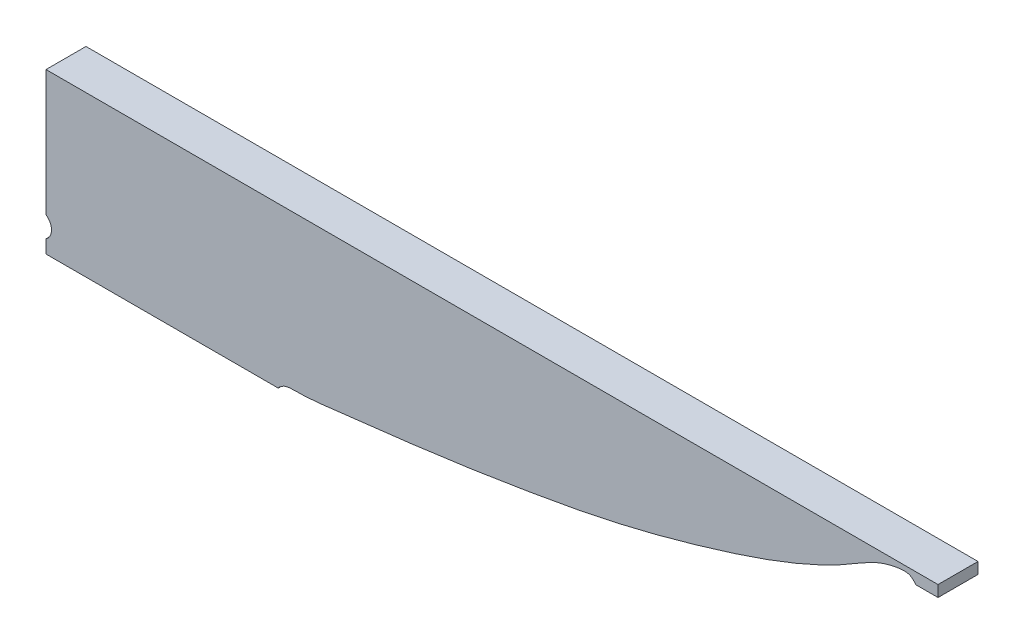
ISO-10303-21;
HEADER;
FILE_DESCRIPTION(('STEP AP214'),'2;1');
FILE_NAME('part.step','',(''),(''),'','','');
FILE_SCHEMA(('AUTOMOTIVE_DESIGN { 1 0 10303 214 1 1 1 1 }'));
ENDSEC;
DATA;
#1=APPLICATION_CONTEXT('core data for automotive mechanical design processes');
#2=APPLICATION_PROTOCOL_DEFINITION('international standard','automotive_design',2000,#1);
#3=PRODUCT_CONTEXT('',#1,'mechanical');
#4=PRODUCT('Part','Part','',(#3));
#5=PRODUCT_RELATED_PRODUCT_CATEGORY('part','',(#4));
#6=PRODUCT_DEFINITION_FORMATION('','',#4);
#7=PRODUCT_DEFINITION_CONTEXT('part definition',#1,'design');
#8=PRODUCT_DEFINITION('design','',#6,#7);
#9=PRODUCT_DEFINITION_SHAPE('','',#8);
#10=(LENGTH_UNIT() NAMED_UNIT(*) SI_UNIT(.MILLI.,.METRE.));
#11=(NAMED_UNIT(*) PLANE_ANGLE_UNIT() SI_UNIT($,.RADIAN.));
#12=(NAMED_UNIT(*) SI_UNIT($,.STERADIAN.) SOLID_ANGLE_UNIT());
#13=UNCERTAINTY_MEASURE_WITH_UNIT(LENGTH_MEASURE(1.E-05),#10,'distance_accuracy_value','');
#14=(GEOMETRIC_REPRESENTATION_CONTEXT(3) GLOBAL_UNCERTAINTY_ASSIGNED_CONTEXT((#13)) GLOBAL_UNIT_ASSIGNED_CONTEXT((#10,
#11,#12)) REPRESENTATION_CONTEXT('',''));
#15=CARTESIAN_POINT('',(0.,0.,0.));
#16=DIRECTION('',(0.,0.,1.));
#17=DIRECTION('',(1.,0.,0.));
#18=AXIS2_PLACEMENT_3D('',#15,#16,#17);
#19=CARTESIAN_POINT('',(-98.6040894013258,-29.7239469125317,348.));
#20=DIRECTION('',(1.,0.,0.));
#21=DIRECTION('',(0.,1.,0.));
#22=AXIS2_PLACEMENT_3D('',#19,#20,#21);
#23=PLANE('',#22);
#24=DIRECTION('',(0.,-1.,0.));
#25=VECTOR('',#24,1.);
#26=CARTESIAN_POINT('',(-98.6040894013258,-29.7239469125317,340.));
#27=LINE('',#26,#25);
#28=CARTESIAN_POINT('',(-98.6040894013259,2.25600000000003,340.));
#29=VERTEX_POINT('',#28);
#30=CARTESIAN_POINT('',(-98.6040894013258,-22.9260102216961,340.));
#31=VERTEX_POINT('',#30);
#32=EDGE_CURVE('E249',#29,#31,#27,.T.);
#33=ORIENTED_EDGE('',*,*,#32,.T.);
#34=DIRECTION('',(0.,0.,1.));
#35=VECTOR('',#34,1.);
#36=CARTESIAN_POINT('',(-98.6040894013258,-22.9260102216961,308.));
#37=LINE('',#36,#35);
#38=CARTESIAN_POINT('',(-98.6040894013258,-22.9260102216961,348.));
#39=VERTEX_POINT('',#38);
#40=EDGE_CURVE('E48',#31,#39,#37,.T.);
#41=ORIENTED_EDGE('',*,*,#40,.T.);
#42=DIRECTION('',(0.,-1.,0.));
#43=VECTOR('',#42,1.);
#44=CARTESIAN_POINT('',(-98.6040894013258,-29.7239469125317,348.));
#45=LINE('',#44,#43);
#46=CARTESIAN_POINT('',(-98.6040894013259,2.25600000000003,348.));
#47=VERTEX_POINT('',#46);
#48=EDGE_CURVE('E110',#47,#39,#45,.T.);
#49=ORIENTED_EDGE('',*,*,#48,.F.);
#50=DIRECTION('',(0.,0.,-1.));
#51=VECTOR('',#50,1.);
#52=CARTESIAN_POINT('',(-98.6040894013259,2.25600000000003,348.));
#53=LINE('',#52,#51);
#54=EDGE_CURVE('E118',#47,#29,#53,.T.);
#55=ORIENTED_EDGE('',*,*,#54,.T.);
#56=EDGE_LOOP('',(#33,#41,#49,#55));
#57=FACE_BOUND('',#56,.T.);
#58=ADVANCED_FACE('F30',(#57),#23,.F.);
#59=CARTESIAN_POINT('',(-52.1281131693495,-29.7166877930422,348.));
#60=CARTESIAN_POINT('',(-52.0995053627368,-29.6320972195329,348.));
#61=CARTESIAN_POINT('',(-52.0443855113816,-29.5596511110775,348.));
#62=CARTESIAN_POINT('',(-51.9165864841557,-29.4370919254883,348.));
#63=CARTESIAN_POINT('',(-51.8451033274468,-29.3835647898649,348.));
#64=CARTESIAN_POINT('',(-51.6313881627872,-29.2239622082223,348.));
#65=CARTESIAN_POINT('',(-51.4931209305618,-29.1112858655769,348.));
#66=CARTESIAN_POINT('',(-51.1984295097013,-28.9170889701397,348.));
#67=CARTESIAN_POINT('',(-51.0442060322619,-28.8320198182207,348.));
#68=CARTESIAN_POINT('',(-50.713957336304,-28.7000130172434,348.));
#69=CARTESIAN_POINT('',(-50.5419408093826,-28.6518833204163,348.));
#70=CARTESIAN_POINT('',(-50.030023312427,-28.5436872691055,348.));
#71=CARTESIAN_POINT('',(-49.685493995314,-28.5148823178442,348.));
#72=CARTESIAN_POINT('',(-48.9946460185332,-28.4811189074498,348.));
#73=CARTESIAN_POINT('',(-48.6480370055703,-28.4800299743328,348.));
#74=CARTESIAN_POINT('',(-47.954684499721,-28.4796443163151,348.));
#75=CARTESIAN_POINT('',(-47.6081581140018,-28.4774679083085,348.));
#76=CARTESIAN_POINT('',(-46.9162937320026,-28.4572195738005,348.));
#77=CARTESIAN_POINT('',(-46.5707701625665,-28.4415440442141,348.));
#78=CARTESIAN_POINT('',(-45.5353386091637,-28.3790413714786,348.));
#79=CARTESIAN_POINT('',(-44.8466233650242,-28.3160101619262,348.));
#80=CARTESIAN_POINT('',(-43.4704683983988,-28.1726190370116,348.));
#81=CARTESIAN_POINT('',(-42.7829916895016,-28.0944002970588,348.));
#82=CARTESIAN_POINT('',(-41.4078616737232,-27.9406205308839,348.));
#83=CARTESIAN_POINT('',(-40.7204051604364,-27.862774382537,348.));
#84=CARTESIAN_POINT('',(-38.6584432756487,-27.625642888848,348.));
#85=CARTESIAN_POINT('',(-37.2843372509964,-27.4628386544795,348.));
#86=CARTESIAN_POINT('',(-30.4138404887522,-26.6488204428296,348.));
#87=CARTESIAN_POINT('',(-24.9178558461367,-25.9918664618382,348.));
#88=CARTESIAN_POINT('',(-16.6906844294339,-24.8786323561055,348.));
#89=CARTESIAN_POINT('',(-13.9513040373142,-24.4854608577558,348.));
#90=CARTESIAN_POINT('',(-8.48000898374198,-23.6533493094659,348.));
#91=CARTESIAN_POINT('',(-5.7477371532889,-23.2156426183402,348.));
#92=CARTESIAN_POINT('',(-0.28878615144563,-22.3043592450924,348.));
#93=CARTESIAN_POINT('',(2.4380041353122,-21.8314802497401,348.));
#94=CARTESIAN_POINT('',(7.87978318132648,-20.8274307799263,348.));
#95=CARTESIAN_POINT('',(10.5948117787178,-20.2952329816622,348.));
#96=CARTESIAN_POINT('',(16.006228378957,-19.1348723657777,348.));
#97=CARTESIAN_POINT('',(18.7021838024936,-18.505450454686,348.));
#98=CARTESIAN_POINT('',(24.0675889665441,-17.1535917158673,348.));
#99=CARTESIAN_POINT('',(26.738584431247,-16.4329210797134,348.));
#100=CARTESIAN_POINT('',(32.0631921055614,-14.9251459593873,348.));
#101=CARTESIAN_POINT('',(34.7165244984636,-14.1366996791444,348.));
#102=CARTESIAN_POINT('',(39.9965833036704,-12.4774376326274,348.));
#103=CARTESIAN_POINT('',(42.6246975018148,-11.6084220276393,348.));
#104=CARTESIAN_POINT('',(46.5323199416705,-10.2092633029267,348.));
#105=CARTESIAN_POINT('',(47.8297964859057,-9.72621123992148,348.));
#106=CARTESIAN_POINT('',(50.4057874103195,-8.71815271985391,348.));
#107=CARTESIAN_POINT('',(51.6835927219261,-8.1926685107684,348.));
#108=CARTESIAN_POINT('',(54.2194196074373,-7.10004623476012,348.));
#109=CARTESIAN_POINT('',(55.4777127958928,-6.5334800412648,348.));
#110=CARTESIAN_POINT('',(57.9682193419352,-5.34543762747387,348.));
#111=CARTESIAN_POINT('',(59.2000970375749,-4.72325468455399,348.));
#112=CARTESIAN_POINT('',(61.0182316482238,-3.72748616373887,348.));
#113=CARTESIAN_POINT('',(61.6195096983678,-3.38552697701847,348.));
#114=CARTESIAN_POINT('',(62.8169979912281,-2.690938540452,348.));
#115=CARTESIAN_POINT('',(63.412417007407,-2.3366183141175,348.));
#116=CARTESIAN_POINT('',(65.2037591222549,-1.28454738807753,348.));
#117=CARTESIAN_POINT('',(66.406228416744,-0.600936364165263,348.));
#118=CARTESIAN_POINT('',(68.3075110070237,0.214082518122503,348.));
#119=CARTESIAN_POINT('',(68.9581060846543,0.449457792647763,348.));
#120=CARTESIAN_POINT('',(69.9600113451258,0.746432622176092,348.));
#121=CARTESIAN_POINT('',(70.2991951551462,0.836564312973523,348.));
#122=CARTESIAN_POINT('',(70.979825134982,0.994645895743109,348.));
#123=CARTESIAN_POINT('',(71.3217193041282,1.06246798429514,348.));
#124=CARTESIAN_POINT('',(72.0090808900067,1.1727273272418,348.));
#125=CARTESIAN_POINT('',(72.3545025815768,1.2154894193728,348.));
#126=CARTESIAN_POINT('',(72.8780795627454,1.24095449232189,348.));
#127=CARTESIAN_POINT('',(73.0534758672314,1.24325767654903,348.));
#128=CARTESIAN_POINT('',(73.4064124812422,1.23263274321834,348.));
#129=CARTESIAN_POINT('',(73.5818528601305,1.21906013270898,348.));
#130=CARTESIAN_POINT('',(73.9278258973997,1.16230942070344,348.));
#131=CARTESIAN_POINT('',(74.1012094435894,1.11755062661426,348.));
#132=CARTESIAN_POINT('',(74.4245352801542,0.97846731963688,348.));
#133=CARTESIAN_POINT('',(74.5708109938971,0.881388516289111,348.));
#134=CARTESIAN_POINT('',(74.8462513421887,0.6584003652206,348.));
#135=CARTESIAN_POINT('',(74.9719086039233,0.534087390309516,348.));
#136=CARTESIAN_POINT('',(75.1659624312435,0.353534807089396,348.));
#137=CARTESIAN_POINT('',(75.2308393131836,0.293554935322086,348.));
#138=CARTESIAN_POINT('',(75.3484064980287,0.160644875556014,348.));
#139=CARTESIAN_POINT('',(75.3980965585318,0.0858851203523404,348.));
#140=CARTESIAN_POINT('',(75.4224900030192,0.,348.));
#141=B_SPLINE_CURVE_WITH_KNOTS('',3,(#59,#60,#61,#62,#63,#64,#65,#66,#67,#68,#69,#70,#71,#72,
#73,#74,#75,#76,#77,#78,#79,#80,#81,#82,#83,#84,#85,#86,#87,#88,#89,#90,#91,#92,#93,#94,#95,#96,
#97,#98,#99,#100,#101,#102,#103,#104,#105,#106,#107,#108,#109,#110,#111,#112,#113,#114,#115,
#116,#117,#118,#119,#120,#121,#122,#123,#124,#125,#126,#127,#128,#129,#130,#131,#132,#133,#134,
#135,#136,#137,#138,#139,#140),.UNSPECIFIED.,.F.,.F.,(4,2,2,2,2,2,2,2,2,2,2,2,2,2,2,2,2,2,2,2,2,
2,2,2,2,2,2,2,2,2,2,2,2,2,2,2,2,2,2,2,4),(0.,0.00195312499999989,0.00390624999999989,0.0078125,
0.01171875,0.015625,0.0234375000000001,0.0312500000000002,0.0390625000000003,0.0468750000000003,
0.0625000000000004,0.0781250000000004,0.0937500000000004,0.125000000000001,0.25,0.3125,0.375,
0.4375,0.5,0.5625,0.625,0.6875,0.75,0.78125,0.8125,0.84375,0.875,0.890625,0.90625,0.9375,
0.953125,0.9609375,0.96875,0.9765625,0.98046875,0.984375,0.98828125,0.9921875,0.99609375,
0.998046875,1.),.UNSPECIFIED.);
#142=DIRECTION('',(0.,0.,-1.));
#143=VECTOR('',#142,1.);
#144=SURFACE_OF_LINEAR_EXTRUSION('',#141,#143);
#145=CARTESIAN_POINT('',(-52.1281131693495,-29.7166877930422,340.));
#146=CARTESIAN_POINT('',(-52.0995053627368,-29.6320972195329,340.));
#147=CARTESIAN_POINT('',(-52.0443855113816,-29.5596511110775,340.));
#148=CARTESIAN_POINT('',(-51.9165864841557,-29.4370919254883,340.));
#149=CARTESIAN_POINT('',(-51.8451033274468,-29.3835647898649,340.));
#150=CARTESIAN_POINT('',(-51.6313881627872,-29.2239622082223,340.));
#151=CARTESIAN_POINT('',(-51.4931209305618,-29.1112858655769,340.));
#152=CARTESIAN_POINT('',(-51.1984295097013,-28.9170889701397,340.));
#153=CARTESIAN_POINT('',(-51.0442060322619,-28.8320198182207,340.));
#154=CARTESIAN_POINT('',(-50.713957336304,-28.7000130172434,340.));
#155=CARTESIAN_POINT('',(-50.5419408093826,-28.6518833204163,340.));
#156=CARTESIAN_POINT('',(-50.030023312427,-28.5436872691055,340.));
#157=CARTESIAN_POINT('',(-49.685493995314,-28.5148823178442,340.));
#158=CARTESIAN_POINT('',(-48.9946460185332,-28.4811189074498,340.));
#159=CARTESIAN_POINT('',(-48.6480370055703,-28.4800299743328,340.));
#160=CARTESIAN_POINT('',(-47.954684499721,-28.4796443163151,340.));
#161=CARTESIAN_POINT('',(-47.6081581140018,-28.4774679083085,340.));
#162=CARTESIAN_POINT('',(-46.9162937320026,-28.4572195738005,340.));
#163=CARTESIAN_POINT('',(-46.5707701625665,-28.4415440442141,340.));
#164=CARTESIAN_POINT('',(-45.5353386091637,-28.3790413714786,340.));
#165=CARTESIAN_POINT('',(-44.8466233650242,-28.3160101619262,340.));
#166=CARTESIAN_POINT('',(-43.4704683983988,-28.1726190370116,340.));
#167=CARTESIAN_POINT('',(-42.7829916895016,-28.0944002970588,340.));
#168=CARTESIAN_POINT('',(-41.4078616737232,-27.9406205308839,340.));
#169=CARTESIAN_POINT('',(-40.7204051604364,-27.862774382537,340.));
#170=CARTESIAN_POINT('',(-38.6584432756487,-27.625642888848,340.));
#171=CARTESIAN_POINT('',(-37.2843372509964,-27.4628386544795,340.));
#172=CARTESIAN_POINT('',(-30.4138404887522,-26.6488204428296,340.));
#173=CARTESIAN_POINT('',(-24.9178558461367,-25.9918664618382,340.));
#174=CARTESIAN_POINT('',(-16.6906844294339,-24.8786323561055,340.));
#175=CARTESIAN_POINT('',(-13.9513040373142,-24.4854608577558,340.));
#176=CARTESIAN_POINT('',(-8.48000898374198,-23.6533493094659,340.));
#177=CARTESIAN_POINT('',(-5.7477371532889,-23.2156426183402,340.));
#178=CARTESIAN_POINT('',(-0.28878615144563,-22.3043592450924,340.));
#179=CARTESIAN_POINT('',(2.4380041353122,-21.8314802497401,340.));
#180=CARTESIAN_POINT('',(7.87978318132648,-20.8274307799263,340.));
#181=CARTESIAN_POINT('',(10.5948117787178,-20.2952329816622,340.));
#182=CARTESIAN_POINT('',(16.006228378957,-19.1348723657777,340.));
#183=CARTESIAN_POINT('',(18.7021838024936,-18.505450454686,340.));
#184=CARTESIAN_POINT('',(24.0675889665441,-17.1535917158673,340.));
#185=CARTESIAN_POINT('',(26.738584431247,-16.4329210797134,340.));
#186=CARTESIAN_POINT('',(32.0631921055614,-14.9251459593873,340.));
#187=CARTESIAN_POINT('',(34.7165244984636,-14.1366996791444,340.));
#188=CARTESIAN_POINT('',(39.9965833036704,-12.4774376326274,340.));
#189=CARTESIAN_POINT('',(42.6246975018148,-11.6084220276393,340.));
#190=CARTESIAN_POINT('',(46.5323199416705,-10.2092633029267,340.));
#191=CARTESIAN_POINT('',(47.8297964859057,-9.72621123992148,340.));
#192=CARTESIAN_POINT('',(50.4057874103195,-8.71815271985391,340.));
#193=CARTESIAN_POINT('',(51.6835927219261,-8.1926685107684,340.));
#194=CARTESIAN_POINT('',(54.2194196074373,-7.10004623476012,340.));
#195=CARTESIAN_POINT('',(55.4777127958928,-6.5334800412648,340.));
#196=CARTESIAN_POINT('',(57.9682193419352,-5.34543762747387,340.));
#197=CARTESIAN_POINT('',(59.2000970375749,-4.72325468455399,340.));
#198=CARTESIAN_POINT('',(61.0182316482238,-3.72748616373887,340.));
#199=CARTESIAN_POINT('',(61.6195096983678,-3.38552697701847,340.));
#200=CARTESIAN_POINT('',(62.8169979912281,-2.690938540452,340.));
#201=CARTESIAN_POINT('',(63.412417007407,-2.3366183141175,340.));
#202=CARTESIAN_POINT('',(65.2037591222549,-1.28454738807753,340.));
#203=CARTESIAN_POINT('',(66.406228416744,-0.600936364165263,340.));
#204=CARTESIAN_POINT('',(68.3075110070237,0.214082518122503,340.));
#205=CARTESIAN_POINT('',(68.9581060846543,0.449457792647763,340.));
#206=CARTESIAN_POINT('',(69.9600113451258,0.746432622176092,340.));
#207=CARTESIAN_POINT('',(70.2991951551462,0.836564312973523,340.));
#208=CARTESIAN_POINT('',(70.979825134982,0.994645895743109,340.));
#209=CARTESIAN_POINT('',(71.3217193041282,1.06246798429514,340.));
#210=CARTESIAN_POINT('',(72.0090808900067,1.1727273272418,340.));
#211=CARTESIAN_POINT('',(72.3545025815768,1.2154894193728,340.));
#212=CARTESIAN_POINT('',(72.8780795627454,1.24095449232189,340.));
#213=CARTESIAN_POINT('',(73.0534758672314,1.24325767654903,340.));
#214=CARTESIAN_POINT('',(73.4064124812422,1.23263274321834,340.));
#215=CARTESIAN_POINT('',(73.5818528601305,1.21906013270898,340.));
#216=CARTESIAN_POINT('',(73.9278258973997,1.16230942070344,340.));
#217=CARTESIAN_POINT('',(74.1012094435894,1.11755062661426,340.));
#218=CARTESIAN_POINT('',(74.4245352801542,0.97846731963688,340.));
#219=CARTESIAN_POINT('',(74.5708109938971,0.881388516289111,340.));
#220=CARTESIAN_POINT('',(74.8462513421887,0.6584003652206,340.));
#221=CARTESIAN_POINT('',(74.9719086039233,0.534087390309516,340.));
#222=CARTESIAN_POINT('',(75.1659624312435,0.353534807089396,340.));
#223=CARTESIAN_POINT('',(75.2308393131836,0.293554935322086,340.));
#224=CARTESIAN_POINT('',(75.3484064980287,0.160644875556014,340.));
#225=CARTESIAN_POINT('',(75.3980965585318,0.0858851203523404,340.));
#226=CARTESIAN_POINT('',(75.4224900030192,0.,340.));
#227=B_SPLINE_CURVE_WITH_KNOTS('',3,(#145,#146,#147,#148,#149,#150,#151,#152,#153,#154,#155,
#156,#157,#158,#159,#160,#161,#162,#163,#164,#165,#166,#167,#168,#169,#170,#171,#172,#173,#174,
#175,#176,#177,#178,#179,#180,#181,#182,#183,#184,#185,#186,#187,#188,#189,#190,#191,#192,#193,
#194,#195,#196,#197,#198,#199,#200,#201,#202,#203,#204,#205,#206,#207,#208,#209,#210,#211,#212,
#213,#214,#215,#216,#217,#218,#219,#220,#221,#222,#223,#224,#225,#226),.UNSPECIFIED.,.F.,.F.,(4,
2,2,2,2,2,2,2,2,2,2,2,2,2,2,2,2,2,2,2,2,2,2,2,2,2,2,2,2,2,2,2,2,2,2,2,2,2,2,2,4),(0.,
0.00195312499999989,0.00390624999999989,0.0078125,0.01171875,0.015625,0.0234375000000001,
0.0312500000000002,0.0390625000000003,0.0468750000000003,0.0625000000000004,0.0781250000000004,
0.0937500000000004,0.125000000000001,0.25,0.3125,0.375,0.4375,0.5,0.5625,0.625,0.6875,0.75,
0.78125,0.8125,0.84375,0.875,0.890625,0.90625,0.9375,0.953125,0.9609375,0.96875,0.9765625,
0.98046875,0.984375,0.98828125,0.9921875,0.99609375,0.998046875,1.),.UNSPECIFIED.);
#228=CARTESIAN_POINT('',(-52.1281131693495,-29.7166877930422,340.));
#229=VERTEX_POINT('',#228);
#230=CARTESIAN_POINT('',(75.422490003019,-1.11020608396621E-13,340.));
#231=VERTEX_POINT('',#230);
#232=EDGE_CURVE('E227',#229,#231,#227,.T.);
#233=ORIENTED_EDGE('',*,*,#232,.T.);
#234=DIRECTION('',(0.,0.,-1.));
#235=VECTOR('',#234,1.);
#236=CARTESIAN_POINT('',(75.422490003019,-1.11020608396621E-13,348.));
#237=LINE('',#236,#235);
#238=CARTESIAN_POINT('',(75.422490003019,-1.11020608396621E-13,348.));
#239=VERTEX_POINT('',#238);
#240=EDGE_CURVE('E42',#239,#231,#237,.T.);
#241=ORIENTED_EDGE('',*,*,#240,.F.);
#242=CARTESIAN_POINT('',(75.4224900030192,0.,348.));
#243=CARTESIAN_POINT('',(75.3980965585318,0.0858851203523404,348.));
#244=CARTESIAN_POINT('',(75.3484064980287,0.160644875556014,348.));
#245=CARTESIAN_POINT('',(75.2308393131836,0.293554935322086,348.));
#246=CARTESIAN_POINT('',(75.1659624312435,0.353534807089396,348.));
#247=CARTESIAN_POINT('',(74.9719086039233,0.534087390309516,348.));
#248=CARTESIAN_POINT('',(74.8462513421887,0.6584003652206,348.));
#249=CARTESIAN_POINT('',(74.5708109938971,0.881388516289111,348.));
#250=CARTESIAN_POINT('',(74.4245352801542,0.97846731963688,348.));
#251=CARTESIAN_POINT('',(74.1012094435894,1.11755062661426,348.));
#252=CARTESIAN_POINT('',(73.9278258973997,1.16230942070344,348.));
#253=CARTESIAN_POINT('',(73.5818528601305,1.21906013270898,348.));
#254=CARTESIAN_POINT('',(73.4064124812422,1.23263274321834,348.));
#255=CARTESIAN_POINT('',(73.0534758672314,1.24325767654903,348.));
#256=CARTESIAN_POINT('',(72.8780795627454,1.24095449232189,348.));
#257=CARTESIAN_POINT('',(72.3545025815768,1.2154894193728,348.));
#258=CARTESIAN_POINT('',(72.0090808900067,1.1727273272418,348.));
#259=CARTESIAN_POINT('',(71.3217193041282,1.06246798429514,348.));
#260=CARTESIAN_POINT('',(70.979825134982,0.994645895743109,348.));
#261=CARTESIAN_POINT('',(70.2991951551462,0.836564312973523,348.));
#262=CARTESIAN_POINT('',(69.9600113451258,0.746432622176092,348.));
#263=CARTESIAN_POINT('',(68.9581060846543,0.449457792647763,348.));
#264=CARTESIAN_POINT('',(68.3075110070237,0.214082518122503,348.));
#265=CARTESIAN_POINT('',(66.406228416744,-0.600936364165263,348.));
#266=CARTESIAN_POINT('',(65.2037591222549,-1.28454738807753,348.));
#267=CARTESIAN_POINT('',(63.412417007407,-2.3366183141175,348.));
#268=CARTESIAN_POINT('',(62.8169979912281,-2.690938540452,348.));
#269=CARTESIAN_POINT('',(61.6195096983678,-3.38552697701847,348.));
#270=CARTESIAN_POINT('',(61.0182316482238,-3.72748616373887,348.));
#271=CARTESIAN_POINT('',(59.2000970375749,-4.72325468455399,348.));
#272=CARTESIAN_POINT('',(57.9682193419352,-5.34543762747387,348.));
#273=CARTESIAN_POINT('',(55.4777127958928,-6.5334800412648,348.));
#274=CARTESIAN_POINT('',(54.2194196074373,-7.10004623476012,348.));
#275=CARTESIAN_POINT('',(51.6835927219261,-8.1926685107684,348.));
#276=CARTESIAN_POINT('',(50.4057874103195,-8.71815271985391,348.));
#277=CARTESIAN_POINT('',(47.8297964859057,-9.72621123992148,348.));
#278=CARTESIAN_POINT('',(46.5323199416705,-10.2092633029267,348.));
#279=CARTESIAN_POINT('',(42.6246975018148,-11.6084220276393,348.));
#280=CARTESIAN_POINT('',(39.9965833036704,-12.4774376326274,348.));
#281=CARTESIAN_POINT('',(34.7165244984636,-14.1366996791444,348.));
#282=CARTESIAN_POINT('',(32.0631921055614,-14.9251459593873,348.));
#283=CARTESIAN_POINT('',(26.738584431247,-16.4329210797134,348.));
#284=CARTESIAN_POINT('',(24.0675889665441,-17.1535917158673,348.));
#285=CARTESIAN_POINT('',(18.7021838024936,-18.505450454686,348.));
#286=CARTESIAN_POINT('',(16.006228378957,-19.1348723657777,348.));
#287=CARTESIAN_POINT('',(10.5948117787178,-20.2952329816622,348.));
#288=CARTESIAN_POINT('',(7.87978318132648,-20.8274307799263,348.));
#289=CARTESIAN_POINT('',(2.4380041353122,-21.8314802497401,348.));
#290=CARTESIAN_POINT('',(-0.28878615144563,-22.3043592450924,348.));
#291=CARTESIAN_POINT('',(-5.7477371532889,-23.2156426183402,348.));
#292=CARTESIAN_POINT('',(-8.48000898374198,-23.6533493094659,348.));
#293=CARTESIAN_POINT('',(-13.9513040373142,-24.4854608577558,348.));
#294=CARTESIAN_POINT('',(-16.6906844294339,-24.8786323561055,348.));
#295=CARTESIAN_POINT('',(-24.9178558461367,-25.9918664618382,348.));
#296=CARTESIAN_POINT('',(-30.4138404887522,-26.6488204428296,348.));
#297=CARTESIAN_POINT('',(-37.2843372509964,-27.4628386544795,348.));
#298=CARTESIAN_POINT('',(-38.6584432756487,-27.625642888848,348.));
#299=CARTESIAN_POINT('',(-40.7204051604364,-27.862774382537,348.));
#300=CARTESIAN_POINT('',(-41.4078616737232,-27.9406205308839,348.));
#301=CARTESIAN_POINT('',(-42.7829916895016,-28.0944002970588,348.));
#302=CARTESIAN_POINT('',(-43.4704683983988,-28.1726190370116,348.));
#303=CARTESIAN_POINT('',(-44.8466233650242,-28.3160101619262,348.));
#304=CARTESIAN_POINT('',(-45.5353386091637,-28.3790413714786,348.));
#305=CARTESIAN_POINT('',(-46.5707701625665,-28.4415440442141,348.));
#306=CARTESIAN_POINT('',(-46.9162937320026,-28.4572195738005,348.));
#307=CARTESIAN_POINT('',(-47.6081581140018,-28.4774679083085,348.));
#308=CARTESIAN_POINT('',(-47.954684499721,-28.4796443163151,348.));
#309=CARTESIAN_POINT('',(-48.6480370055703,-28.4800299743328,348.));
#310=CARTESIAN_POINT('',(-48.9946460185332,-28.4811189074498,348.));
#311=CARTESIAN_POINT('',(-49.685493995314,-28.5148823178442,348.));
#312=CARTESIAN_POINT('',(-50.030023312427,-28.5436872691055,348.));
#313=CARTESIAN_POINT('',(-50.5419408093826,-28.6518833204163,348.));
#314=CARTESIAN_POINT('',(-50.713957336304,-28.7000130172434,348.));
#315=CARTESIAN_POINT('',(-51.0442060322619,-28.8320198182207,348.));
#316=CARTESIAN_POINT('',(-51.1984295097013,-28.9170889701397,348.));
#317=CARTESIAN_POINT('',(-51.4931209305618,-29.1112858655769,348.));
#318=CARTESIAN_POINT('',(-51.6313881627872,-29.2239622082223,348.));
#319=CARTESIAN_POINT('',(-51.8451033274468,-29.3835647898649,348.));
#320=CARTESIAN_POINT('',(-51.9165864841557,-29.4370919254883,348.));
#321=CARTESIAN_POINT('',(-52.0443855113816,-29.5596511110775,348.));
#322=CARTESIAN_POINT('',(-52.0995053627368,-29.6320972195329,348.));
#323=CARTESIAN_POINT('',(-52.1281131693495,-29.7166877930422,348.));
#324=B_SPLINE_CURVE_WITH_KNOTS('',3,(#242,#243,#244,#245,#246,#247,#248,#249,#250,#251,#252,
#253,#254,#255,#256,#257,#258,#259,#260,#261,#262,#263,#264,#265,#266,#267,#268,#269,#270,#271,
#272,#273,#274,#275,#276,#277,#278,#279,#280,#281,#282,#283,#284,#285,#286,#287,#288,#289,#290,
#291,#292,#293,#294,#295,#296,#297,#298,#299,#300,#301,#302,#303,#304,#305,#306,#307,#308,#309,
#310,#311,#312,#313,#314,#315,#316,#317,#318,#319,#320,#321,#322,#323),.UNSPECIFIED.,.F.,.F.,(4,
2,2,2,2,2,2,2,2,2,2,2,2,2,2,2,2,2,2,2,2,2,2,2,2,2,2,2,2,2,2,2,2,2,2,2,2,2,2,2,4),(0.,
0.00195312499999989,0.00390624999999978,0.00781249999999989,0.0117187499999999,0.015625,
0.01953125,0.0234375,0.0312500000000001,0.0390625000000002,0.0468750000000003,
0.0625000000000001,0.0937499999999999,0.109375,0.125,0.15625,0.1875,0.21875,0.25,0.3125,0.375,
0.4375,0.5,0.5625,0.625,0.6875,0.75,0.874999999999999,0.90625,0.921875,0.9375,0.953125,
0.9609375,0.96875,0.9765625,0.984375,0.98828125,0.9921875,0.99609375,0.998046875,1.),.UNSPECIFIED.);
#325=CARTESIAN_POINT('',(-52.1281131693495,-29.7166877930422,348.));
#326=VERTEX_POINT('',#325);
#327=EDGE_CURVE('E209',#326,#239,#324,.F.);
#328=ORIENTED_EDGE('',*,*,#327,.F.);
#329=DIRECTION('',(0.,0.,-1.));
#330=VECTOR('',#329,1.);
#331=CARTESIAN_POINT('',(-52.1281131693495,-29.7166877930422,348.));
#332=LINE('',#331,#330);
#333=EDGE_CURVE('E129',#326,#229,#332,.T.);
#334=ORIENTED_EDGE('',*,*,#333,.T.);
#335=EDGE_LOOP('',(#233,#241,#328,#334));
#336=FACE_BOUND('',#335,.T.);
#337=ADVANCED_FACE('F32',(#336),#144,.F.);
#338=CARTESIAN_POINT('',(75.422490003019,-1.11020608396621E-13,348.));
#339=DIRECTION('',(0.,1.,0.));
#340=DIRECTION('',(-1.,0.,0.));
#341=AXIS2_PLACEMENT_3D('',#338,#339,#340);
#342=PLANE('',#341);
#343=DIRECTION('',(1.,0.,0.));
#344=VECTOR('',#343,1.);
#345=CARTESIAN_POINT('',(75.422490003019,-1.11020608396621E-13,340.));
#346=LINE('',#345,#344);
#347=CARTESIAN_POINT('',(79.8884650066989,0.,340.));
#348=VERTEX_POINT('',#347);
#349=EDGE_CURVE('E175',#231,#348,#346,.T.);
#350=ORIENTED_EDGE('',*,*,#349,.T.);
#351=DIRECTION('',(0.,0.,-1.));
#352=VECTOR('',#351,1.);
#353=CARTESIAN_POINT('',(79.8884650066989,0.,348.));
#354=LINE('',#353,#352);
#355=CARTESIAN_POINT('',(79.8884650066989,0.,348.));
#356=VERTEX_POINT('',#355);
#357=EDGE_CURVE('E179',#356,#348,#354,.T.);
#358=ORIENTED_EDGE('',*,*,#357,.F.);
#359=DIRECTION('',(1.,0.,0.));
#360=VECTOR('',#359,1.);
#361=CARTESIAN_POINT('',(75.422490003019,-1.11020608396621E-13,348.));
#362=LINE('',#361,#360);
#363=EDGE_CURVE('E95',#239,#356,#362,.T.);
#364=ORIENTED_EDGE('',*,*,#363,.F.);
#365=ORIENTED_EDGE('',*,*,#240,.T.);
#366=EDGE_LOOP('',(#350,#358,#364,#365));
#367=FACE_BOUND('',#366,.T.);
#368=ADVANCED_FACE('F260',(#367),#342,.F.);
#369=CARTESIAN_POINT('',(79.8884650066989,2.25600000000004,348.));
#370=DIRECTION('',(-1.,0.,0.));
#371=DIRECTION('',(0.,0.,1.));
#372=AXIS2_PLACEMENT_3D('',#369,#370,#371);
#373=PLANE('',#372);
#374=DIRECTION('',(0.,1.,0.));
#375=VECTOR('',#374,1.);
#376=CARTESIAN_POINT('',(79.8884650066989,2.25600000000004,340.));
#377=LINE('',#376,#375);
#378=CARTESIAN_POINT('',(79.8884650066989,2.25600000000004,340.));
#379=VERTEX_POINT('',#378);
#380=EDGE_CURVE('E170',#348,#379,#377,.T.);
#381=ORIENTED_EDGE('',*,*,#380,.T.);
#382=DIRECTION('',(0.,0.,-1.));
#383=VECTOR('',#382,1.);
#384=CARTESIAN_POINT('',(79.8884650066989,2.25600000000004,348.));
#385=LINE('',#384,#383);
#386=CARTESIAN_POINT('',(79.8884650066989,2.25600000000004,348.));
#387=VERTEX_POINT('',#386);
#388=EDGE_CURVE('E125',#387,#379,#385,.T.);
#389=ORIENTED_EDGE('',*,*,#388,.F.);
#390=DIRECTION('',(0.,1.,0.));
#391=VECTOR('',#390,1.);
#392=CARTESIAN_POINT('',(79.8884650066989,2.25600000000004,348.));
#393=LINE('',#392,#391);
#394=EDGE_CURVE('E112',#356,#387,#393,.T.);
#395=ORIENTED_EDGE('',*,*,#394,.F.);
#396=ORIENTED_EDGE('',*,*,#357,.T.);
#397=EDGE_LOOP('',(#381,#389,#395,#396));
#398=FACE_BOUND('',#397,.T.);
#399=ADVANCED_FACE('F263',(#398),#373,.F.);
#400=CARTESIAN_POINT('',(79.8884650066989,2.25600000000004,348.));
#401=DIRECTION('',(0.,-1.,0.));
#402=DIRECTION('',(1.,0.,0.));
#403=AXIS2_PLACEMENT_3D('',#400,#401,#402);
#404=PLANE('',#403);
#405=DIRECTION('',(-1.,0.,0.));
#406=VECTOR('',#405,1.);
#407=CARTESIAN_POINT('',(79.8884650066989,2.25600000000004,340.));
#408=LINE('',#407,#406);
#409=EDGE_CURVE('E121',#379,#29,#408,.T.);
#410=ORIENTED_EDGE('',*,*,#409,.T.);
#411=ORIENTED_EDGE('',*,*,#54,.F.);
#412=DIRECTION('',(-1.,0.,0.));
#413=VECTOR('',#412,1.);
#414=CARTESIAN_POINT('',(79.8884650066989,2.25600000000004,348.));
#415=LINE('',#414,#413);
#416=EDGE_CURVE('E105',#387,#47,#415,.T.);
#417=ORIENTED_EDGE('',*,*,#416,.F.);
#418=ORIENTED_EDGE('',*,*,#388,.T.);
#419=EDGE_LOOP('',(#410,#411,#417,#418));
#420=FACE_BOUND('',#419,.T.);
#421=ADVANCED_FACE('F119',(#420),#404,.F.);
#422=CARTESIAN_POINT('',(-98.6040894013258,-27.0739897783039,348.));
#423=VERTEX_POINT('',#422);
#424=CARTESIAN_POINT('',(-98.6040894013258,-29.7239469125317,348.));
#425=VERTEX_POINT('',#424);
#426=EDGE_CURVE('E36',#423,#425,#45,.T.);
#427=ORIENTED_EDGE('',*,*,#426,.F.);
#428=DIRECTION('',(0.,0.,1.));
#429=VECTOR('',#428,1.);
#430=CARTESIAN_POINT('',(-98.6040894013258,-27.0739897783039,308.));
#431=LINE('',#430,#429);
#432=CARTESIAN_POINT('',(-98.6040894013258,-27.0739897783039,340.));
#433=VERTEX_POINT('',#432);
#434=EDGE_CURVE('E269',#423,#433,#431,.F.);
#435=ORIENTED_EDGE('',*,*,#434,.T.);
#436=CARTESIAN_POINT('',(-98.6040894013258,-29.7239469125317,340.));
#437=VERTEX_POINT('',#436);
#438=EDGE_CURVE('E176',#433,#437,#27,.T.);
#439=ORIENTED_EDGE('',*,*,#438,.T.);
#440=DIRECTION('',(0.,0.,-1.));
#441=VECTOR('',#440,1.);
#442=CARTESIAN_POINT('',(-98.6040894013258,-29.7239469125317,348.));
#443=LINE('',#442,#441);
#444=EDGE_CURVE('E126',#425,#437,#443,.T.);
#445=ORIENTED_EDGE('',*,*,#444,.F.);
#446=EDGE_LOOP('',(#427,#435,#439,#445));
#447=FACE_BOUND('',#446,.T.);
#448=ADVANCED_FACE('F159',(#447),#23,.F.);
#449=CARTESIAN_POINT('',(-98.6040894013259,-29.7239469125317,348.));
#450=CARTESIAN_POINT('',(-83.1120971716762,-29.7228813767196,348.));
#451=CARTESIAN_POINT('',(-67.6201049324579,-29.7206362962601,348.));
#452=CARTESIAN_POINT('',(-52.1281131693495,-29.7166877930422,348.));
#453=B_SPLINE_CURVE_WITH_KNOTS('',3,(#449,#450,#451,#452),.UNSPECIFIED.,.F.,.F.,(4,4),(0.,1.),.UNSPECIFIED.);
#454=DIRECTION('',(0.,0.,-1.));
#455=VECTOR('',#454,1.);
#456=SURFACE_OF_LINEAR_EXTRUSION('',#453,#455);
#457=CARTESIAN_POINT('',(-98.6040894013259,-29.7239469125317,340.));
#458=CARTESIAN_POINT('',(-83.1120971716762,-29.7228813767196,340.));
#459=CARTESIAN_POINT('',(-67.6201049324579,-29.7206362962601,340.));
#460=CARTESIAN_POINT('',(-52.1281131693495,-29.7166877930422,340.));
#461=B_SPLINE_CURVE_WITH_KNOTS('',3,(#457,#458,#459,#460),.UNSPECIFIED.,.F.,.F.,(4,4),(0.,1.),.UNSPECIFIED.);
#462=EDGE_CURVE('E85',#437,#229,#461,.T.);
#463=ORIENTED_EDGE('',*,*,#462,.T.);
#464=ORIENTED_EDGE('',*,*,#333,.F.);
#465=CARTESIAN_POINT('',(-52.1281131693495,-29.7166877930422,348.));
#466=CARTESIAN_POINT('',(-67.6201049324579,-29.7206362962601,348.));
#467=CARTESIAN_POINT('',(-83.1120971716762,-29.7228813767196,348.));
#468=CARTESIAN_POINT('',(-98.6040894013259,-29.7239469125317,348.));
#469=B_SPLINE_CURVE_WITH_KNOTS('',3,(#465,#466,#467,#468),.UNSPECIFIED.,.F.,.F.,(4,4),(0.,1.),.UNSPECIFIED.);
#470=EDGE_CURVE('E57',#425,#326,#469,.F.);
#471=ORIENTED_EDGE('',*,*,#470,.F.);
#472=ORIENTED_EDGE('',*,*,#444,.T.);
#473=EDGE_LOOP('',(#463,#464,#471,#472));
#474=FACE_BOUND('',#473,.T.);
#475=ADVANCED_FACE('F148',(#474),#456,.F.);
#476=CARTESIAN_POINT('',(13.3005200788373,-19.71505267372,348.));
#477=DIRECTION('',(0.,0.,-1.));
#478=DIRECTION('',(-1.,0.,0.));
#479=AXIS2_PLACEMENT_3D('',#476,#477,#478);
#480=PLANE('',#479);
#481=ORIENTED_EDGE('',*,*,#48,.T.);
#482=CARTESIAN_POINT('',(-100.,-25.,348.));
#483=DIRECTION('',(0.,0.,-1.));
#484=DIRECTION('',(-1.,0.,0.));
#485=AXIS2_PLACEMENT_3D('',#482,#483,#484);
#486=CIRCLE('',#485,2.5);
#487=EDGE_CURVE('E275',#39,#423,#486,.T.);
#488=ORIENTED_EDGE('',*,*,#487,.T.);
#489=ORIENTED_EDGE('',*,*,#426,.T.);
#490=ORIENTED_EDGE('',*,*,#470,.T.);
#491=ORIENTED_EDGE('',*,*,#327,.T.);
#492=ORIENTED_EDGE('',*,*,#363,.T.);
#493=ORIENTED_EDGE('',*,*,#394,.T.);
#494=ORIENTED_EDGE('',*,*,#416,.T.);
#495=EDGE_LOOP('',(#481,#488,#489,#490,#491,#492,#493,#494));
#496=FACE_BOUND('',#495,.T.);
#497=ADVANCED_FACE('F107',(#496),#480,.F.);
#498=CARTESIAN_POINT('',(13.3005200788373,-19.71505267372,340.));
#499=DIRECTION('',(0.,0.,-1.));
#500=DIRECTION('',(-1.,0.,0.));
#501=AXIS2_PLACEMENT_3D('',#498,#499,#500);
#502=PLANE('',#501);
#503=CARTESIAN_POINT('',(-100.,-25.,340.));
#504=DIRECTION('',(0.,0.,-1.));
#505=DIRECTION('',(-1.,0.,0.));
#506=AXIS2_PLACEMENT_3D('',#503,#504,#505);
#507=CIRCLE('',#506,2.5);
#508=EDGE_CURVE('E11',#31,#433,#507,.T.);
#509=ORIENTED_EDGE('',*,*,#508,.F.);
#510=ORIENTED_EDGE('',*,*,#32,.F.);
#511=ORIENTED_EDGE('',*,*,#409,.F.);
#512=ORIENTED_EDGE('',*,*,#380,.F.);
#513=ORIENTED_EDGE('',*,*,#349,.F.);
#514=ORIENTED_EDGE('',*,*,#232,.F.);
#515=ORIENTED_EDGE('',*,*,#462,.F.);
#516=ORIENTED_EDGE('',*,*,#438,.F.);
#517=EDGE_LOOP('',(#509,#510,#511,#512,#513,#514,#515,#516));
#518=FACE_BOUND('',#517,.T.);
#519=ADVANCED_FACE('F160',(#518),#502,.T.);
#520=CARTESIAN_POINT('',(-100.,-25.,308.));
#521=DIRECTION('',(0.,0.,1.));
#522=DIRECTION('',(1.,0.,0.));
#523=AXIS2_PLACEMENT_3D('',#520,#521,#522);
#524=CYLINDRICAL_SURFACE('',#523,2.5);
#525=ORIENTED_EDGE('',*,*,#40,.F.);
#526=ORIENTED_EDGE('',*,*,#508,.T.);
#527=ORIENTED_EDGE('',*,*,#434,.F.);
#528=ORIENTED_EDGE('',*,*,#487,.F.);
#529=EDGE_LOOP('',(#525,#526,#527,#528));
#530=FACE_BOUND('',#529,.T.);
#531=ADVANCED_FACE('F192',(#530),#524,.F.);
#532=CLOSED_SHELL('',(#58,#337,#368,#399,#421,#448,#475,#497,#519,#531));
#533=MANIFOLD_SOLID_BREP('B2',#532);
#534=ADVANCED_BREP_SHAPE_REPRESENTATION('',(#18,#533),#14);
#535=SHAPE_DEFINITION_REPRESENTATION(#9,#534);
ENDSEC;
END-ISO-10303-21;
